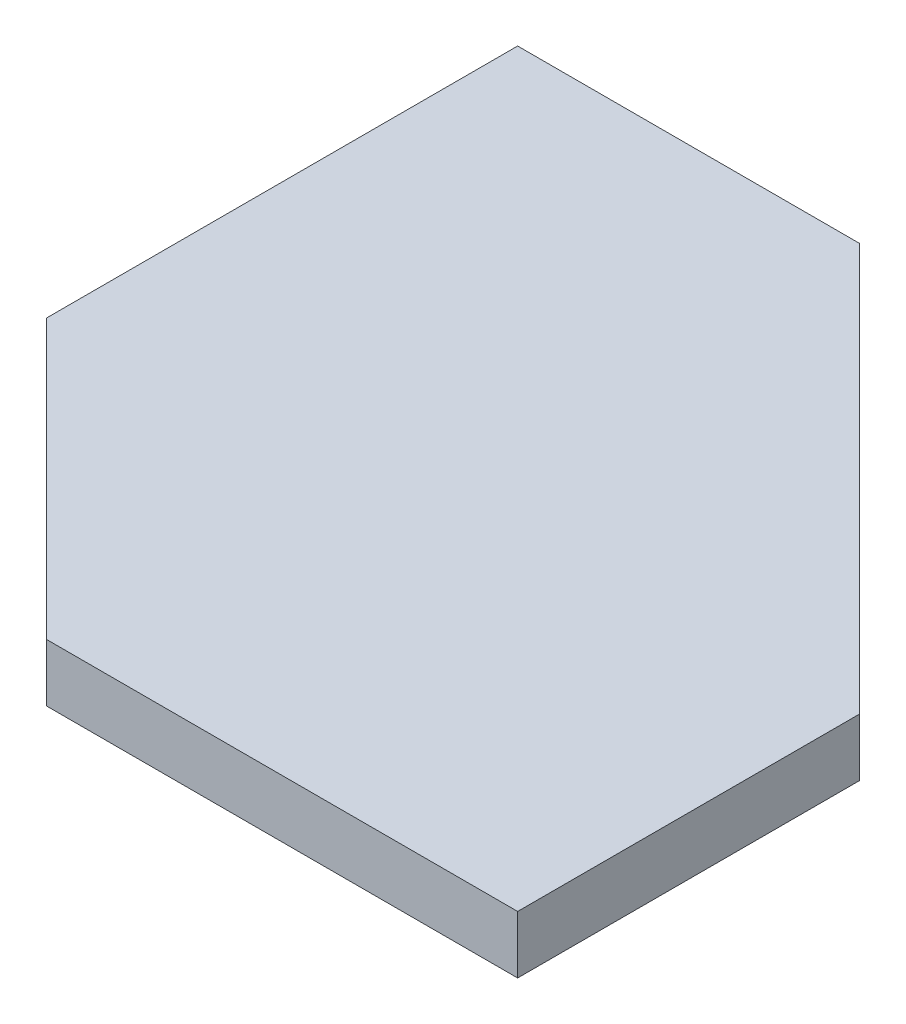
ISO-10303-21;
HEADER;
FILE_DESCRIPTION(('STEP AP214'),'2;1');
FILE_NAME('part.step','',(''),(''),'','','');
FILE_SCHEMA(('AUTOMOTIVE_DESIGN { 1 0 10303 214 1 1 1 1 }'));
ENDSEC;
DATA;
#1=APPLICATION_CONTEXT('core data for automotive mechanical design processes');
#2=APPLICATION_PROTOCOL_DEFINITION('international standard','automotive_design',2000,#1);
#3=PRODUCT_CONTEXT('',#1,'mechanical');
#4=PRODUCT('Part','Part','',(#3));
#5=PRODUCT_RELATED_PRODUCT_CATEGORY('part','',(#4));
#6=PRODUCT_DEFINITION_FORMATION('','',#4);
#7=PRODUCT_DEFINITION_CONTEXT('part definition',#1,'design');
#8=PRODUCT_DEFINITION('design','',#6,#7);
#9=PRODUCT_DEFINITION_SHAPE('','',#8);
#10=(LENGTH_UNIT() NAMED_UNIT(*) SI_UNIT(.MILLI.,.METRE.));
#11=(NAMED_UNIT(*) PLANE_ANGLE_UNIT() SI_UNIT($,.RADIAN.));
#12=(NAMED_UNIT(*) SI_UNIT($,.STERADIAN.) SOLID_ANGLE_UNIT());
#13=UNCERTAINTY_MEASURE_WITH_UNIT(LENGTH_MEASURE(1.E-05),#10,'distance_accuracy_value','');
#14=(GEOMETRIC_REPRESENTATION_CONTEXT(3) GLOBAL_UNCERTAINTY_ASSIGNED_CONTEXT((#13)) GLOBAL_UNIT_ASSIGNED_CONTEXT((#10,
#11,#12)) REPRESENTATION_CONTEXT('',''));
#15=CARTESIAN_POINT('',(0.,0.,0.));
#16=DIRECTION('',(0.,0.,1.));
#17=DIRECTION('',(1.,0.,0.));
#18=AXIS2_PLACEMENT_3D('',#15,#16,#17);
#19=CARTESIAN_POINT('',(300.,50.,300.));
#20=DIRECTION('',(-1.,0.,0.));
#21=DIRECTION('',(0.,0.,1.));
#22=AXIS2_PLACEMENT_3D('',#19,#20,#21);
#23=PLANE('',#22);
#24=DIRECTION('',(0.,0.,-1.));
#25=VECTOR('',#24,1.);
#26=CARTESIAN_POINT('',(300.,0.,300.));
#27=LINE('',#26,#25);
#28=CARTESIAN_POINT('',(300.,0.,350.));
#29=VERTEX_POINT('',#28);
#30=CARTESIAN_POINT('',(300.,0.,53.5533905932736));
#31=VERTEX_POINT('',#30);
#32=EDGE_CURVE('E119',#29,#31,#27,.T.);
#33=ORIENTED_EDGE('',*,*,#32,.T.);
#34=DIRECTION('',(0.,1.,0.));
#35=VECTOR('',#34,1.);
#36=CARTESIAN_POINT('',(300.,-500.,53.5533905932736));
#37=LINE('',#36,#35);
#38=CARTESIAN_POINT('',(300.,50.,53.5533905932736));
#39=VERTEX_POINT('',#38);
#40=EDGE_CURVE('E59',#31,#39,#37,.T.);
#41=ORIENTED_EDGE('',*,*,#40,.T.);
#42=DIRECTION('',(0.,0.,-1.));
#43=VECTOR('',#42,1.);
#44=CARTESIAN_POINT('',(300.,50.,300.));
#45=LINE('',#44,#43);
#46=CARTESIAN_POINT('',(300.,50.,350.));
#47=VERTEX_POINT('',#46);
#48=EDGE_CURVE('E132',#47,#39,#45,.T.);
#49=ORIENTED_EDGE('',*,*,#48,.F.);
#50=DIRECTION('',(0.,-1.,0.));
#51=VECTOR('',#50,1.);
#52=CARTESIAN_POINT('',(300.,50.,350.));
#53=LINE('',#52,#51);
#54=EDGE_CURVE('E114',#47,#29,#53,.T.);
#55=ORIENTED_EDGE('',*,*,#54,.T.);
#56=EDGE_LOOP('',(#33,#41,#49,#55));
#57=FACE_BOUND('',#56,.T.);
#58=ADVANCED_FACE('F40',(#57),#23,.F.);
#59=CARTESIAN_POINT('',(-300.,50.,-300.));
#60=DIRECTION('',(0.,0.,1.));
#61=DIRECTION('',(1.,0.,0.));
#62=AXIS2_PLACEMENT_3D('',#59,#60,#61);
#63=PLANE('',#62);
#64=DIRECTION('',(-1.,0.,0.));
#65=VECTOR('',#64,1.);
#66=CARTESIAN_POINT('',(-300.,50.,-300.));
#67=LINE('',#66,#65);
#68=CARTESIAN_POINT('',(-53.5533905932739,50.,-300.));
#69=VERTEX_POINT('',#68);
#70=CARTESIAN_POINT('',(-350.,50.,-300.));
#71=VERTEX_POINT('',#70);
#72=EDGE_CURVE('E95',#69,#71,#67,.T.);
#73=ORIENTED_EDGE('',*,*,#72,.F.);
#74=DIRECTION('',(0.,1.,0.));
#75=VECTOR('',#74,1.);
#76=CARTESIAN_POINT('',(-53.5533905932739,-500.,-300.));
#77=LINE('',#76,#75);
#78=CARTESIAN_POINT('',(-53.5533905932739,0.,-300.));
#79=VERTEX_POINT('',#78);
#80=EDGE_CURVE('E144',#79,#69,#77,.T.);
#81=ORIENTED_EDGE('',*,*,#80,.F.);
#82=DIRECTION('',(-1.,0.,0.));
#83=VECTOR('',#82,1.);
#84=CARTESIAN_POINT('',(-300.,0.,-300.));
#85=LINE('',#84,#83);
#86=CARTESIAN_POINT('',(-350.,0.,-300.));
#87=VERTEX_POINT('',#86);
#88=EDGE_CURVE('E123',#79,#87,#85,.T.);
#89=ORIENTED_EDGE('',*,*,#88,.T.);
#90=DIRECTION('',(0.,-1.,0.));
#91=VECTOR('',#90,1.);
#92=CARTESIAN_POINT('',(-350.,50.,-300.));
#93=LINE('',#92,#91);
#94=EDGE_CURVE('E12',#71,#87,#93,.T.);
#95=ORIENTED_EDGE('',*,*,#94,.F.);
#96=EDGE_LOOP('',(#73,#81,#89,#95));
#97=FACE_BOUND('',#96,.T.);
#98=ADVANCED_FACE('F166',(#97),#63,.F.);
#99=CARTESIAN_POINT('',(-350.,50.,158.578643762691));
#100=DIRECTION('',(1.,0.,0.));
#101=DIRECTION('',(0.,0.,-1.));
#102=AXIS2_PLACEMENT_3D('',#99,#100,#101);
#103=PLANE('',#102);
#104=DIRECTION('',(0.,0.,1.));
#105=VECTOR('',#104,1.);
#106=CARTESIAN_POINT('',(-350.,0.,158.578643762691));
#107=LINE('',#106,#105);
#108=CARTESIAN_POINT('',(-350.,0.,108.578643762691));
#109=VERTEX_POINT('',#108);
#110=EDGE_CURVE('E102',#87,#109,#107,.T.);
#111=ORIENTED_EDGE('',*,*,#110,.T.);
#112=DIRECTION('',(0.,-1.,0.));
#113=VECTOR('',#112,1.);
#114=CARTESIAN_POINT('',(-350.,50.,108.578643762691));
#115=LINE('',#114,#113);
#116=CARTESIAN_POINT('',(-350.,50.,108.578643762691));
#117=VERTEX_POINT('',#116);
#118=EDGE_CURVE('E44',#117,#109,#115,.T.);
#119=ORIENTED_EDGE('',*,*,#118,.F.);
#120=DIRECTION('',(0.,0.,1.));
#121=VECTOR('',#120,1.);
#122=CARTESIAN_POINT('',(-350.,50.,158.578643762691));
#123=LINE('',#122,#121);
#124=EDGE_CURVE('E86',#71,#117,#123,.T.);
#125=ORIENTED_EDGE('',*,*,#124,.F.);
#126=ORIENTED_EDGE('',*,*,#94,.T.);
#127=EDGE_LOOP('',(#111,#119,#125,#126));
#128=FACE_BOUND('',#127,.T.);
#129=ADVANCED_FACE('F42',(#128),#103,.F.);
#130=CARTESIAN_POINT('',(-300.,50.,158.578643762691));
#131=DIRECTION('',(0.707106781186547,0.,-0.707106781186548));
#132=DIRECTION('',(-0.707106781186548,0.,-0.707106781186547));
#133=AXIS2_PLACEMENT_3D('',#130,#131,#132);
#134=PLANE('',#133);
#135=DIRECTION('',(0.707106781186548,0.,0.707106781186547));
#136=VECTOR('',#135,1.);
#137=CARTESIAN_POINT('',(-300.,0.,158.578643762691));
#138=LINE('',#137,#136);
#139=CARTESIAN_POINT('',(-108.57864376269,0.,350.));
#140=VERTEX_POINT('',#139);
#141=EDGE_CURVE('E126',#109,#140,#138,.T.);
#142=ORIENTED_EDGE('',*,*,#141,.T.);
#143=DIRECTION('',(0.,-1.,0.));
#144=VECTOR('',#143,1.);
#145=CARTESIAN_POINT('',(-108.57864376269,50.,350.));
#146=LINE('',#145,#144);
#147=CARTESIAN_POINT('',(-108.57864376269,50.,350.));
#148=VERTEX_POINT('',#147);
#149=EDGE_CURVE('E106',#148,#140,#146,.T.);
#150=ORIENTED_EDGE('',*,*,#149,.F.);
#151=DIRECTION('',(0.707106781186548,0.,0.707106781186547));
#152=VECTOR('',#151,1.);
#153=CARTESIAN_POINT('',(-300.,50.,158.578643762691));
#154=LINE('',#153,#152);
#155=EDGE_CURVE('E91',#117,#148,#154,.T.);
#156=ORIENTED_EDGE('',*,*,#155,.F.);
#157=ORIENTED_EDGE('',*,*,#118,.T.);
#158=EDGE_LOOP('',(#142,#150,#156,#157));
#159=FACE_BOUND('',#158,.T.);
#160=ADVANCED_FACE('F107',(#159),#134,.F.);
#161=CARTESIAN_POINT('',(-158.578643762691,50.,350.));
#162=DIRECTION('',(0.,0.,-1.));
#163=DIRECTION('',(-1.,0.,0.));
#164=AXIS2_PLACEMENT_3D('',#161,#162,#163);
#165=PLANE('',#164);
#166=DIRECTION('',(1.,0.,0.));
#167=VECTOR('',#166,1.);
#168=CARTESIAN_POINT('',(-158.578643762691,0.,350.));
#169=LINE('',#168,#167);
#170=EDGE_CURVE('E129',#140,#29,#169,.T.);
#171=ORIENTED_EDGE('',*,*,#170,.T.);
#172=ORIENTED_EDGE('',*,*,#54,.F.);
#173=DIRECTION('',(1.,0.,0.));
#174=VECTOR('',#173,1.);
#175=CARTESIAN_POINT('',(-158.578643762691,50.,350.));
#176=LINE('',#175,#174);
#177=EDGE_CURVE('E111',#148,#47,#176,.T.);
#178=ORIENTED_EDGE('',*,*,#177,.F.);
#179=ORIENTED_EDGE('',*,*,#149,.T.);
#180=EDGE_LOOP('',(#171,#172,#178,#179));
#181=FACE_BOUND('',#180,.T.);
#182=ADVANCED_FACE('F168',(#181),#165,.F.);
#183=CARTESIAN_POINT('',(0.,50.,0.));
#184=DIRECTION('',(0.,-1.,0.));
#185=DIRECTION('',(0.,0.,-1.));
#186=AXIS2_PLACEMENT_3D('',#183,#184,#185);
#187=PLANE('',#186);
#188=ORIENTED_EDGE('',*,*,#48,.T.);
#189=DIRECTION('',(0.707106781186548,0.,0.707106781186547));
#190=VECTOR('',#189,1.);
#191=CARTESIAN_POINT('',(300.,50.,53.5533905932736));
#192=LINE('',#191,#190);
#193=EDGE_CURVE('E148',#69,#39,#192,.T.);
#194=ORIENTED_EDGE('',*,*,#193,.F.);
#195=ORIENTED_EDGE('',*,*,#72,.T.);
#196=ORIENTED_EDGE('',*,*,#124,.T.);
#197=ORIENTED_EDGE('',*,*,#155,.T.);
#198=ORIENTED_EDGE('',*,*,#177,.T.);
#199=EDGE_LOOP('',(#188,#194,#195,#196,#197,#198));
#200=FACE_BOUND('',#199,.T.);
#201=ADVANCED_FACE('F89',(#200),#187,.F.);
#202=CARTESIAN_POINT('',(0.,0.,0.));
#203=DIRECTION('',(0.,-1.,0.));
#204=DIRECTION('',(0.,0.,-1.));
#205=AXIS2_PLACEMENT_3D('',#202,#203,#204);
#206=PLANE('',#205);
#207=DIRECTION('',(0.707106781186548,0.,0.707106781186547));
#208=VECTOR('',#207,1.);
#209=CARTESIAN_POINT('',(300.,0.,53.5533905932736));
#210=LINE('',#209,#208);
#211=EDGE_CURVE('E141',#79,#31,#210,.T.);
#212=ORIENTED_EDGE('',*,*,#211,.T.);
#213=ORIENTED_EDGE('',*,*,#32,.F.);
#214=ORIENTED_EDGE('',*,*,#170,.F.);
#215=ORIENTED_EDGE('',*,*,#141,.F.);
#216=ORIENTED_EDGE('',*,*,#110,.F.);
#217=ORIENTED_EDGE('',*,*,#88,.F.);
#218=EDGE_LOOP('',(#212,#213,#214,#215,#216,#217));
#219=FACE_BOUND('',#218,.T.);
#220=ADVANCED_FACE('F159',(#219),#206,.T.);
#221=CARTESIAN_POINT('',(300.,-500.,53.5533905932736));
#222=DIRECTION('',(-0.707106781186547,0.,0.707106781186548));
#223=DIRECTION('',(0.707106781186548,0.,0.707106781186547));
#224=AXIS2_PLACEMENT_3D('',#221,#222,#223);
#225=PLANE('',#224);
#226=ORIENTED_EDGE('',*,*,#80,.T.);
#227=ORIENTED_EDGE('',*,*,#193,.T.);
#228=ORIENTED_EDGE('',*,*,#40,.F.);
#229=ORIENTED_EDGE('',*,*,#211,.F.);
#230=EDGE_LOOP('',(#226,#227,#228,#229));
#231=FACE_BOUND('',#230,.T.);
#232=ADVANCED_FACE('F163',(#231),#225,.F.);
#233=CLOSED_SHELL('',(#58,#98,#129,#160,#182,#201,#220,#232));
#234=MANIFOLD_SOLID_BREP('B2',#233);
#235=ADVANCED_BREP_SHAPE_REPRESENTATION('',(#18,#234),#14);
#236=SHAPE_DEFINITION_REPRESENTATION(#9,#235);
ENDSEC;
END-ISO-10303-21;
